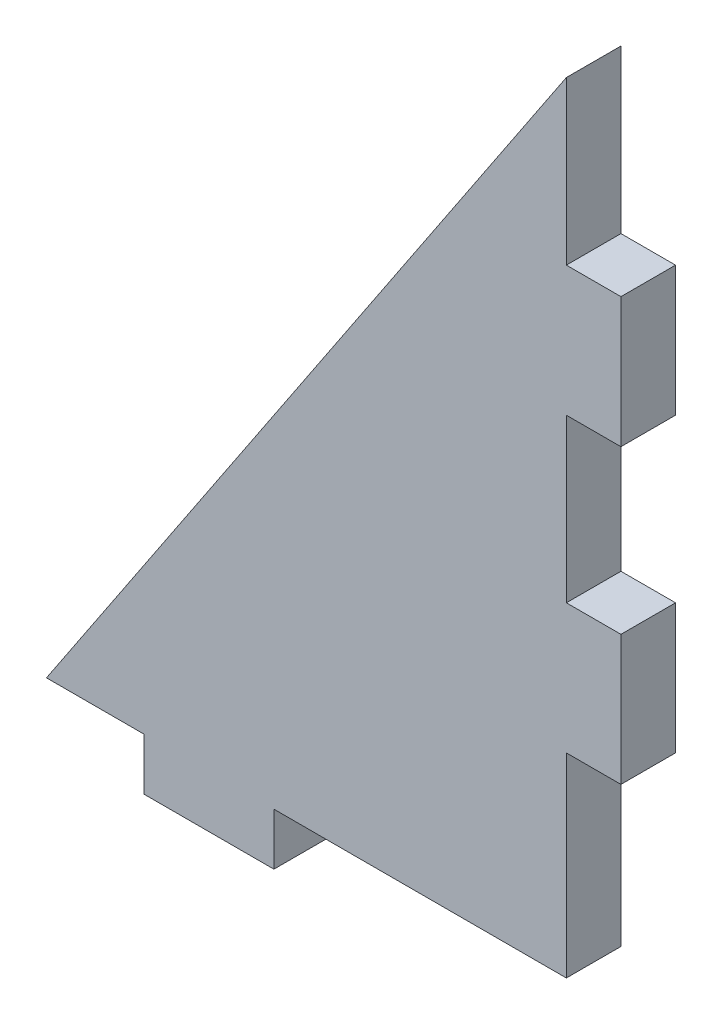
ISO-10303-21;
HEADER;
FILE_DESCRIPTION(('STEP AP214'),'2;1');
FILE_NAME('part.step','',(''),(''),'','','');
FILE_SCHEMA(('AUTOMOTIVE_DESIGN { 1 0 10303 214 1 1 1 1 }'));
ENDSEC;
DATA;
#1=APPLICATION_CONTEXT('core data for automotive mechanical design processes');
#2=APPLICATION_PROTOCOL_DEFINITION('international standard','automotive_design',2000,#1);
#3=PRODUCT_CONTEXT('',#1,'mechanical');
#4=PRODUCT('Part','Part','',(#3));
#5=PRODUCT_RELATED_PRODUCT_CATEGORY('part','',(#4));
#6=PRODUCT_DEFINITION_FORMATION('','',#4);
#7=PRODUCT_DEFINITION_CONTEXT('part definition',#1,'design');
#8=PRODUCT_DEFINITION('design','',#6,#7);
#9=PRODUCT_DEFINITION_SHAPE('','',#8);
#10=(LENGTH_UNIT() NAMED_UNIT(*) SI_UNIT(.MILLI.,.METRE.));
#11=(NAMED_UNIT(*) PLANE_ANGLE_UNIT() SI_UNIT($,.RADIAN.));
#12=(NAMED_UNIT(*) SI_UNIT($,.STERADIAN.) SOLID_ANGLE_UNIT());
#13=UNCERTAINTY_MEASURE_WITH_UNIT(LENGTH_MEASURE(1.E-05),#10,'distance_accuracy_value','');
#14=(GEOMETRIC_REPRESENTATION_CONTEXT(3) GLOBAL_UNCERTAINTY_ASSIGNED_CONTEXT((#13)) GLOBAL_UNIT_ASSIGNED_CONTEXT((#10,
#11,#12)) REPRESENTATION_CONTEXT('',''));
#15=CARTESIAN_POINT('',(0.,0.,0.));
#16=DIRECTION('',(0.,0.,1.));
#17=DIRECTION('',(1.,0.,0.));
#18=AXIS2_PLACEMENT_3D('',#15,#16,#17);
#19=CARTESIAN_POINT('',(-28.575,0.,5.334));
#20=DIRECTION('',(0.,1.,0.));
#21=DIRECTION('',(0.,0.,1.));
#22=AXIS2_PLACEMENT_3D('',#19,#20,#21);
#23=PLANE('',#22);
#24=DIRECTION('',(1.,0.,0.));
#25=VECTOR('',#24,1.);
#26=CARTESIAN_POINT('',(-28.575,0.,0.));
#27=LINE('',#26,#25);
#28=CARTESIAN_POINT('',(-28.575,0.,0.));
#29=VERTEX_POINT('',#28);
#30=CARTESIAN_POINT('',(0.,0.,0.));
#31=VERTEX_POINT('',#30);
#32=EDGE_CURVE('E174',#29,#31,#27,.T.);
#33=ORIENTED_EDGE('',*,*,#32,.T.);
#34=DIRECTION('',(0.,0.,-1.));
#35=VECTOR('',#34,1.);
#36=CARTESIAN_POINT('',(0.,0.,5.334));
#37=LINE('',#36,#35);
#38=CARTESIAN_POINT('',(0.,0.,5.334));
#39=VERTEX_POINT('',#38);
#40=EDGE_CURVE('E11',#39,#31,#37,.T.);
#41=ORIENTED_EDGE('',*,*,#40,.F.);
#42=DIRECTION('',(1.,0.,0.));
#43=VECTOR('',#42,1.);
#44=CARTESIAN_POINT('',(-28.575,0.,5.334));
#45=LINE('',#44,#43);
#46=CARTESIAN_POINT('',(-28.575,0.,5.334));
#47=VERTEX_POINT('',#46);
#48=EDGE_CURVE('E202',#47,#39,#45,.T.);
#49=ORIENTED_EDGE('',*,*,#48,.F.);
#50=DIRECTION('',(0.,0.,-1.));
#51=VECTOR('',#50,1.);
#52=CARTESIAN_POINT('',(-28.575,0.,5.334));
#53=LINE('',#52,#51);
#54=EDGE_CURVE('E170',#47,#29,#53,.T.);
#55=ORIENTED_EDGE('',*,*,#54,.T.);
#56=EDGE_LOOP('',(#33,#41,#49,#55));
#57=FACE_BOUND('',#56,.T.);
#58=ADVANCED_FACE('F36',(#57),#23,.F.);
#59=CARTESIAN_POINT('',(0.,0.,5.334));
#60=DIRECTION('',(-1.,0.,0.));
#61=DIRECTION('',(0.,0.,1.));
#62=AXIS2_PLACEMENT_3D('',#59,#60,#61);
#63=PLANE('',#62);
#64=DIRECTION('',(0.,1.,0.));
#65=VECTOR('',#64,1.);
#66=CARTESIAN_POINT('',(0.,0.,0.));
#67=LINE('',#66,#65);
#68=CARTESIAN_POINT('',(0.,19.05,0.));
#69=VERTEX_POINT('',#68);
#70=EDGE_CURVE('E177',#31,#69,#67,.T.);
#71=ORIENTED_EDGE('',*,*,#70,.T.);
#72=DIRECTION('',(0.,0.,-1.));
#73=VECTOR('',#72,1.);
#74=CARTESIAN_POINT('',(0.,19.05,5.334));
#75=LINE('',#74,#73);
#76=CARTESIAN_POINT('',(0.,19.05,5.334));
#77=VERTEX_POINT('',#76);
#78=EDGE_CURVE('E44',#77,#69,#75,.T.);
#79=ORIENTED_EDGE('',*,*,#78,.F.);
#80=DIRECTION('',(0.,1.,0.));
#81=VECTOR('',#80,1.);
#82=CARTESIAN_POINT('',(0.,0.,5.334));
#83=LINE('',#82,#81);
#84=EDGE_CURVE('E116',#39,#77,#83,.T.);
#85=ORIENTED_EDGE('',*,*,#84,.F.);
#86=ORIENTED_EDGE('',*,*,#40,.T.);
#87=EDGE_LOOP('',(#71,#79,#85,#86));
#88=FACE_BOUND('',#87,.T.);
#89=ADVANCED_FACE('F295',(#88),#63,.F.);
#90=CARTESIAN_POINT('',(0.,19.05,5.334));
#91=DIRECTION('',(0.,1.,0.));
#92=DIRECTION('',(0.,0.,1.));
#93=AXIS2_PLACEMENT_3D('',#90,#91,#92);
#94=PLANE('',#93);
#95=DIRECTION('',(1.,0.,0.));
#96=VECTOR('',#95,1.);
#97=CARTESIAN_POINT('',(0.,19.05,0.));
#98=LINE('',#97,#96);
#99=CARTESIAN_POINT('',(5.33399999999995,19.05,0.));
#100=VERTEX_POINT('',#99);
#101=EDGE_CURVE('E179',#69,#100,#98,.T.);
#102=ORIENTED_EDGE('',*,*,#101,.T.);
#103=DIRECTION('',(0.,0.,-1.));
#104=VECTOR('',#103,1.);
#105=CARTESIAN_POINT('',(5.33399999999995,19.05,5.334));
#106=LINE('',#105,#104);
#107=CARTESIAN_POINT('',(5.33399999999995,19.05,5.334));
#108=VERTEX_POINT('',#107);
#109=EDGE_CURVE('E230',#108,#100,#106,.T.);
#110=ORIENTED_EDGE('',*,*,#109,.F.);
#111=DIRECTION('',(1.,0.,0.));
#112=VECTOR('',#111,1.);
#113=CARTESIAN_POINT('',(0.,19.05,5.334));
#114=LINE('',#113,#112);
#115=EDGE_CURVE('E238',#77,#108,#114,.T.);
#116=ORIENTED_EDGE('',*,*,#115,.F.);
#117=ORIENTED_EDGE('',*,*,#78,.T.);
#118=EDGE_LOOP('',(#102,#110,#116,#117));
#119=FACE_BOUND('',#118,.T.);
#120=ADVANCED_FACE('F236',(#119),#94,.F.);
#121=CARTESIAN_POINT('',(5.33399999999995,19.05,5.334));
#122=DIRECTION('',(-1.,0.,0.));
#123=DIRECTION('',(0.,-1.,0.));
#124=AXIS2_PLACEMENT_3D('',#121,#122,#123);
#125=PLANE('',#124);
#126=DIRECTION('',(0.,1.,0.));
#127=VECTOR('',#126,1.);
#128=CARTESIAN_POINT('',(5.33399999999995,19.05,0.));
#129=LINE('',#128,#127);
#130=CARTESIAN_POINT('',(5.33399999999995,31.75,0.));
#131=VERTEX_POINT('',#130);
#132=EDGE_CURVE('E181',#100,#131,#129,.T.);
#133=ORIENTED_EDGE('',*,*,#132,.T.);
#134=DIRECTION('',(0.,0.,-1.));
#135=VECTOR('',#134,1.);
#136=CARTESIAN_POINT('',(5.33399999999995,31.75,5.334));
#137=LINE('',#136,#135);
#138=CARTESIAN_POINT('',(5.33399999999995,31.75,5.334));
#139=VERTEX_POINT('',#138);
#140=EDGE_CURVE('E227',#139,#131,#137,.T.);
#141=ORIENTED_EDGE('',*,*,#140,.F.);
#142=DIRECTION('',(0.,1.,0.));
#143=VECTOR('',#142,1.);
#144=CARTESIAN_POINT('',(5.33399999999995,19.05,5.334));
#145=LINE('',#144,#143);
#146=EDGE_CURVE('E256',#108,#139,#145,.T.);
#147=ORIENTED_EDGE('',*,*,#146,.F.);
#148=ORIENTED_EDGE('',*,*,#109,.T.);
#149=EDGE_LOOP('',(#133,#141,#147,#148));
#150=FACE_BOUND('',#149,.T.);
#151=ADVANCED_FACE('F247',(#150),#125,.F.);
#152=CARTESIAN_POINT('',(5.33399999999995,31.75,5.334));
#153=DIRECTION('',(0.,-1.,0.));
#154=DIRECTION('',(1.,0.,0.));
#155=AXIS2_PLACEMENT_3D('',#152,#153,#154);
#156=PLANE('',#155);
#157=DIRECTION('',(-1.,0.,0.));
#158=VECTOR('',#157,1.);
#159=CARTESIAN_POINT('',(5.33399999999995,31.75,0.));
#160=LINE('',#159,#158);
#161=CARTESIAN_POINT('',(0.,31.75,0.));
#162=VERTEX_POINT('',#161);
#163=EDGE_CURVE('E183',#131,#162,#160,.T.);
#164=ORIENTED_EDGE('',*,*,#163,.T.);
#165=DIRECTION('',(0.,0.,-1.));
#166=VECTOR('',#165,1.);
#167=CARTESIAN_POINT('',(0.,31.75,5.334));
#168=LINE('',#167,#166);
#169=CARTESIAN_POINT('',(0.,31.75,5.334));
#170=VERTEX_POINT('',#169);
#171=EDGE_CURVE('E224',#170,#162,#168,.T.);
#172=ORIENTED_EDGE('',*,*,#171,.F.);
#173=DIRECTION('',(-1.,0.,0.));
#174=VECTOR('',#173,1.);
#175=CARTESIAN_POINT('',(5.33399999999995,31.75,5.334));
#176=LINE('',#175,#174);
#177=EDGE_CURVE('E253',#139,#170,#176,.T.);
#178=ORIENTED_EDGE('',*,*,#177,.F.);
#179=ORIENTED_EDGE('',*,*,#140,.T.);
#180=EDGE_LOOP('',(#164,#172,#178,#179));
#181=FACE_BOUND('',#180,.T.);
#182=ADVANCED_FACE('F251',(#181),#156,.F.);
#183=CARTESIAN_POINT('',(0.,31.75,5.334));
#184=DIRECTION('',(-1.,0.,0.));
#185=DIRECTION('',(0.,-1.,0.));
#186=AXIS2_PLACEMENT_3D('',#183,#184,#185);
#187=PLANE('',#186);
#188=DIRECTION('',(0.,1.,0.));
#189=VECTOR('',#188,1.);
#190=CARTESIAN_POINT('',(0.,31.75,0.));
#191=LINE('',#190,#189);
#192=CARTESIAN_POINT('',(0.,47.625,0.));
#193=VERTEX_POINT('',#192);
#194=EDGE_CURVE('E185',#162,#193,#191,.T.);
#195=ORIENTED_EDGE('',*,*,#194,.T.);
#196=DIRECTION('',(0.,0.,-1.));
#197=VECTOR('',#196,1.);
#198=CARTESIAN_POINT('',(0.,47.625,5.334));
#199=LINE('',#198,#197);
#200=CARTESIAN_POINT('',(0.,47.625,5.334));
#201=VERTEX_POINT('',#200);
#202=EDGE_CURVE('E221',#201,#193,#199,.T.);
#203=ORIENTED_EDGE('',*,*,#202,.F.);
#204=DIRECTION('',(0.,1.,0.));
#205=VECTOR('',#204,1.);
#206=CARTESIAN_POINT('',(0.,31.75,5.334));
#207=LINE('',#206,#205);
#208=EDGE_CURVE('E255',#170,#201,#207,.T.);
#209=ORIENTED_EDGE('',*,*,#208,.F.);
#210=ORIENTED_EDGE('',*,*,#171,.T.);
#211=EDGE_LOOP('',(#195,#203,#209,#210));
#212=FACE_BOUND('',#211,.T.);
#213=ADVANCED_FACE('F308',(#212),#187,.F.);
#214=CARTESIAN_POINT('',(5.33399999999996,47.625,5.334));
#215=DIRECTION('',(0.,1.,0.));
#216=DIRECTION('',(0.,0.,1.));
#217=AXIS2_PLACEMENT_3D('',#214,#215,#216);
#218=PLANE('',#217);
#219=DIRECTION('',(1.,0.,0.));
#220=VECTOR('',#219,1.);
#221=CARTESIAN_POINT('',(5.33399999999996,47.625,0.));
#222=LINE('',#221,#220);
#223=CARTESIAN_POINT('',(5.33399999999996,47.625,0.));
#224=VERTEX_POINT('',#223);
#225=EDGE_CURVE('E187',#193,#224,#222,.T.);
#226=ORIENTED_EDGE('',*,*,#225,.T.);
#227=DIRECTION('',(0.,0.,-1.));
#228=VECTOR('',#227,1.);
#229=CARTESIAN_POINT('',(5.33399999999996,47.625,5.334));
#230=LINE('',#229,#228);
#231=CARTESIAN_POINT('',(5.33399999999996,47.625,5.334));
#232=VERTEX_POINT('',#231);
#233=EDGE_CURVE('E218',#232,#224,#230,.T.);
#234=ORIENTED_EDGE('',*,*,#233,.F.);
#235=DIRECTION('',(1.,0.,0.));
#236=VECTOR('',#235,1.);
#237=CARTESIAN_POINT('',(5.33399999999996,47.625,5.334));
#238=LINE('',#237,#236);
#239=EDGE_CURVE('E258',#201,#232,#238,.T.);
#240=ORIENTED_EDGE('',*,*,#239,.F.);
#241=ORIENTED_EDGE('',*,*,#202,.T.);
#242=EDGE_LOOP('',(#226,#234,#240,#241));
#243=FACE_BOUND('',#242,.T.);
#244=ADVANCED_FACE('F311',(#243),#218,.F.);
#245=CARTESIAN_POINT('',(5.33399999999995,60.325,5.334));
#246=DIRECTION('',(-1.,0.,0.));
#247=DIRECTION('',(0.,-1.,0.));
#248=AXIS2_PLACEMENT_3D('',#245,#246,#247);
#249=PLANE('',#248);
#250=DIRECTION('',(0.,1.,0.));
#251=VECTOR('',#250,1.);
#252=CARTESIAN_POINT('',(5.33399999999995,60.325,0.));
#253=LINE('',#252,#251);
#254=CARTESIAN_POINT('',(5.33399999999995,60.325,0.));
#255=VERTEX_POINT('',#254);
#256=EDGE_CURVE('E189',#224,#255,#253,.T.);
#257=ORIENTED_EDGE('',*,*,#256,.T.);
#258=DIRECTION('',(0.,0.,-1.));
#259=VECTOR('',#258,1.);
#260=CARTESIAN_POINT('',(5.33399999999995,60.325,5.334));
#261=LINE('',#260,#259);
#262=CARTESIAN_POINT('',(5.33399999999995,60.325,5.334));
#263=VERTEX_POINT('',#262);
#264=EDGE_CURVE('E215',#263,#255,#261,.T.);
#265=ORIENTED_EDGE('',*,*,#264,.F.);
#266=DIRECTION('',(0.,1.,0.));
#267=VECTOR('',#266,1.);
#268=CARTESIAN_POINT('',(5.33399999999995,60.325,5.334));
#269=LINE('',#268,#267);
#270=EDGE_CURVE('E264',#232,#263,#269,.T.);
#271=ORIENTED_EDGE('',*,*,#270,.F.);
#272=ORIENTED_EDGE('',*,*,#233,.T.);
#273=EDGE_LOOP('',(#257,#265,#271,#272));
#274=FACE_BOUND('',#273,.T.);
#275=ADVANCED_FACE('F315',(#274),#249,.F.);
#276=CARTESIAN_POINT('',(0.,60.325,5.334));
#277=DIRECTION('',(0.,-1.,0.));
#278=DIRECTION('',(1.,0.,0.));
#279=AXIS2_PLACEMENT_3D('',#276,#277,#278);
#280=PLANE('',#279);
#281=DIRECTION('',(-1.,0.,0.));
#282=VECTOR('',#281,1.);
#283=CARTESIAN_POINT('',(0.,60.325,0.));
#284=LINE('',#283,#282);
#285=CARTESIAN_POINT('',(0.,60.325,0.));
#286=VERTEX_POINT('',#285);
#287=EDGE_CURVE('E191',#255,#286,#284,.T.);
#288=ORIENTED_EDGE('',*,*,#287,.T.);
#289=DIRECTION('',(0.,0.,-1.));
#290=VECTOR('',#289,1.);
#291=CARTESIAN_POINT('',(0.,60.325,5.334));
#292=LINE('',#291,#290);
#293=CARTESIAN_POINT('',(0.,60.325,5.334));
#294=VERTEX_POINT('',#293);
#295=EDGE_CURVE('E212',#294,#286,#292,.T.);
#296=ORIENTED_EDGE('',*,*,#295,.F.);
#297=DIRECTION('',(-1.,0.,0.));
#298=VECTOR('',#297,1.);
#299=CARTESIAN_POINT('',(0.,60.325,5.334));
#300=LINE('',#299,#298);
#301=EDGE_CURVE('E266',#263,#294,#300,.T.);
#302=ORIENTED_EDGE('',*,*,#301,.F.);
#303=ORIENTED_EDGE('',*,*,#264,.T.);
#304=EDGE_LOOP('',(#288,#296,#302,#303));
#305=FACE_BOUND('',#304,.T.);
#306=ADVANCED_FACE('F319',(#305),#280,.F.);
#307=CARTESIAN_POINT('',(0.,76.2,5.334));
#308=DIRECTION('',(-1.,0.,0.));
#309=DIRECTION('',(0.,-1.,0.));
#310=AXIS2_PLACEMENT_3D('',#307,#308,#309);
#311=PLANE('',#310);
#312=DIRECTION('',(0.,1.,0.));
#313=VECTOR('',#312,1.);
#314=CARTESIAN_POINT('',(0.,76.2,0.));
#315=LINE('',#314,#313);
#316=CARTESIAN_POINT('',(0.,76.2,0.));
#317=VERTEX_POINT('',#316);
#318=EDGE_CURVE('E193',#286,#317,#315,.T.);
#319=ORIENTED_EDGE('',*,*,#318,.T.);
#320=DIRECTION('',(0.,0.,-1.));
#321=VECTOR('',#320,1.);
#322=CARTESIAN_POINT('',(0.,76.2,5.334));
#323=LINE('',#322,#321);
#324=CARTESIAN_POINT('',(0.,76.2,5.334));
#325=VERTEX_POINT('',#324);
#326=EDGE_CURVE('E209',#325,#317,#323,.T.);
#327=ORIENTED_EDGE('',*,*,#326,.F.);
#328=DIRECTION('',(0.,1.,0.));
#329=VECTOR('',#328,1.);
#330=CARTESIAN_POINT('',(0.,76.2,5.334));
#331=LINE('',#330,#329);
#332=EDGE_CURVE('E268',#294,#325,#331,.T.);
#333=ORIENTED_EDGE('',*,*,#332,.F.);
#334=ORIENTED_EDGE('',*,*,#295,.T.);
#335=EDGE_LOOP('',(#319,#327,#333,#334));
#336=FACE_BOUND('',#335,.T.);
#337=ADVANCED_FACE('F323',(#336),#311,.F.);
#338=CARTESIAN_POINT('',(0.,76.2,5.334));
#339=DIRECTION('',(0.832050294337844,-0.554700196225229,0.));
#340=DIRECTION('',(0.554700196225229,0.832050294337844,0.));
#341=AXIS2_PLACEMENT_3D('',#338,#339,#340);
#342=PLANE('',#341);
#343=DIRECTION('',(-0.554700196225229,-0.832050294337844,0.));
#344=VECTOR('',#343,1.);
#345=CARTESIAN_POINT('',(0.,76.2,0.));
#346=LINE('',#345,#344);
#347=CARTESIAN_POINT('',(-50.8,0.,0.));
#348=VERTEX_POINT('',#347);
#349=EDGE_CURVE('E195',#317,#348,#346,.T.);
#350=ORIENTED_EDGE('',*,*,#349,.T.);
#351=DIRECTION('',(0.,0.,-1.));
#352=VECTOR('',#351,1.);
#353=CARTESIAN_POINT('',(-50.8,0.,5.334));
#354=LINE('',#353,#352);
#355=CARTESIAN_POINT('',(-50.8,0.,5.334));
#356=VERTEX_POINT('',#355);
#357=EDGE_CURVE('E206',#356,#348,#354,.T.);
#358=ORIENTED_EDGE('',*,*,#357,.F.);
#359=DIRECTION('',(-0.554700196225229,-0.832050294337844,0.));
#360=VECTOR('',#359,1.);
#361=CARTESIAN_POINT('',(0.,76.2,5.334));
#362=LINE('',#361,#360);
#363=EDGE_CURVE('E270',#325,#356,#362,.T.);
#364=ORIENTED_EDGE('',*,*,#363,.F.);
#365=ORIENTED_EDGE('',*,*,#326,.T.);
#366=EDGE_LOOP('',(#350,#358,#364,#365));
#367=FACE_BOUND('',#366,.T.);
#368=ADVANCED_FACE('F276',(#367),#342,.F.);
#369=CARTESIAN_POINT('',(-50.8,0.,5.334));
#370=DIRECTION('',(0.,1.,0.));
#371=DIRECTION('',(0.,0.,1.));
#372=AXIS2_PLACEMENT_3D('',#369,#370,#371);
#373=PLANE('',#372);
#374=DIRECTION('',(1.,0.,0.));
#375=VECTOR('',#374,1.);
#376=CARTESIAN_POINT('',(-50.8,0.,0.));
#377=LINE('',#376,#375);
#378=CARTESIAN_POINT('',(-41.275,0.,0.));
#379=VERTEX_POINT('',#378);
#380=EDGE_CURVE('E197',#348,#379,#377,.T.);
#381=ORIENTED_EDGE('',*,*,#380,.T.);
#382=DIRECTION('',(0.,0.,-1.));
#383=VECTOR('',#382,1.);
#384=CARTESIAN_POINT('',(-41.275,0.,5.334));
#385=LINE('',#384,#383);
#386=CARTESIAN_POINT('',(-41.275,0.,5.334));
#387=VERTEX_POINT('',#386);
#388=EDGE_CURVE('E165',#387,#379,#385,.T.);
#389=ORIENTED_EDGE('',*,*,#388,.F.);
#390=DIRECTION('',(1.,0.,0.));
#391=VECTOR('',#390,1.);
#392=CARTESIAN_POINT('',(-50.8,0.,5.334));
#393=LINE('',#392,#391);
#394=EDGE_CURVE('E156',#356,#387,#393,.T.);
#395=ORIENTED_EDGE('',*,*,#394,.F.);
#396=ORIENTED_EDGE('',*,*,#357,.T.);
#397=EDGE_LOOP('',(#381,#389,#395,#396));
#398=FACE_BOUND('',#397,.T.);
#399=ADVANCED_FACE('F280',(#398),#373,.F.);
#400=CARTESIAN_POINT('',(-41.275,0.,5.334));
#401=DIRECTION('',(1.,0.,0.));
#402=DIRECTION('',(0.,0.,-1.));
#403=AXIS2_PLACEMENT_3D('',#400,#401,#402);
#404=PLANE('',#403);
#405=DIRECTION('',(0.,-1.,0.));
#406=VECTOR('',#405,1.);
#407=CARTESIAN_POINT('',(-41.275,0.,0.));
#408=LINE('',#407,#406);
#409=CARTESIAN_POINT('',(-41.275,-5.08,0.));
#410=VERTEX_POINT('',#409);
#411=EDGE_CURVE('E164',#379,#410,#408,.T.);
#412=ORIENTED_EDGE('',*,*,#411,.T.);
#413=DIRECTION('',(0.,0.,-1.));
#414=VECTOR('',#413,1.);
#415=CARTESIAN_POINT('',(-41.275,-5.08,5.334));
#416=LINE('',#415,#414);
#417=CARTESIAN_POINT('',(-41.275,-5.08,5.334));
#418=VERTEX_POINT('',#417);
#419=EDGE_CURVE('E161',#418,#410,#416,.T.);
#420=ORIENTED_EDGE('',*,*,#419,.F.);
#421=DIRECTION('',(0.,-1.,0.));
#422=VECTOR('',#421,1.);
#423=CARTESIAN_POINT('',(-41.275,0.,5.334));
#424=LINE('',#423,#422);
#425=EDGE_CURVE('E150',#387,#418,#424,.T.);
#426=ORIENTED_EDGE('',*,*,#425,.F.);
#427=ORIENTED_EDGE('',*,*,#388,.T.);
#428=EDGE_LOOP('',(#412,#420,#426,#427));
#429=FACE_BOUND('',#428,.T.);
#430=ADVANCED_FACE('F162',(#429),#404,.F.);
#431=CARTESIAN_POINT('',(-41.275,-5.08,5.334));
#432=DIRECTION('',(0.,1.,0.));
#433=DIRECTION('',(0.,0.,1.));
#434=AXIS2_PLACEMENT_3D('',#431,#432,#433);
#435=PLANE('',#434);
#436=DIRECTION('',(1.,0.,0.));
#437=VECTOR('',#436,1.);
#438=CARTESIAN_POINT('',(-41.275,-5.08,0.));
#439=LINE('',#438,#437);
#440=CARTESIAN_POINT('',(-28.575,-5.08,0.));
#441=VERTEX_POINT('',#440);
#442=EDGE_CURVE('E102',#410,#441,#439,.T.);
#443=ORIENTED_EDGE('',*,*,#442,.T.);
#444=DIRECTION('',(0.,0.,-1.));
#445=VECTOR('',#444,1.);
#446=CARTESIAN_POINT('',(-28.575,-5.08,5.334));
#447=LINE('',#446,#445);
#448=CARTESIAN_POINT('',(-28.575,-5.08,5.334));
#449=VERTEX_POINT('',#448);
#450=EDGE_CURVE('E166',#449,#441,#447,.T.);
#451=ORIENTED_EDGE('',*,*,#450,.F.);
#452=DIRECTION('',(1.,0.,0.));
#453=VECTOR('',#452,1.);
#454=CARTESIAN_POINT('',(-41.275,-5.08,5.334));
#455=LINE('',#454,#453);
#456=EDGE_CURVE('E154',#418,#449,#455,.T.);
#457=ORIENTED_EDGE('',*,*,#456,.F.);
#458=ORIENTED_EDGE('',*,*,#419,.T.);
#459=EDGE_LOOP('',(#443,#451,#457,#458));
#460=FACE_BOUND('',#459,.T.);
#461=ADVANCED_FACE('F168',(#460),#435,.F.);
#462=CARTESIAN_POINT('',(-28.575,-5.08,5.334));
#463=DIRECTION('',(-1.,0.,0.));
#464=DIRECTION('',(0.,-1.,0.));
#465=AXIS2_PLACEMENT_3D('',#462,#463,#464);
#466=PLANE('',#465);
#467=DIRECTION('',(0.,1.,0.));
#468=VECTOR('',#467,1.);
#469=CARTESIAN_POINT('',(-28.575,-5.08,0.));
#470=LINE('',#469,#468);
#471=EDGE_CURVE('E108',#441,#29,#470,.T.);
#472=ORIENTED_EDGE('',*,*,#471,.T.);
#473=ORIENTED_EDGE('',*,*,#54,.F.);
#474=DIRECTION('',(0.,1.,0.));
#475=VECTOR('',#474,1.);
#476=CARTESIAN_POINT('',(-28.575,-5.08,5.334));
#477=LINE('',#476,#475);
#478=EDGE_CURVE('E52',#449,#47,#477,.T.);
#479=ORIENTED_EDGE('',*,*,#478,.F.);
#480=ORIENTED_EDGE('',*,*,#450,.T.);
#481=EDGE_LOOP('',(#472,#473,#479,#480));
#482=FACE_BOUND('',#481,.T.);
#483=ADVANCED_FACE('F284',(#482),#466,.F.);
#484=CARTESIAN_POINT('',(0.,0.,5.334));
#485=DIRECTION('',(0.,0.,1.));
#486=DIRECTION('',(1.,0.,0.));
#487=AXIS2_PLACEMENT_3D('',#484,#485,#486);
#488=PLANE('',#487);
#489=ORIENTED_EDGE('',*,*,#48,.T.);
#490=ORIENTED_EDGE('',*,*,#84,.T.);
#491=ORIENTED_EDGE('',*,*,#115,.T.);
#492=ORIENTED_EDGE('',*,*,#146,.T.);
#493=ORIENTED_EDGE('',*,*,#177,.T.);
#494=ORIENTED_EDGE('',*,*,#208,.T.);
#495=ORIENTED_EDGE('',*,*,#239,.T.);
#496=ORIENTED_EDGE('',*,*,#270,.T.);
#497=ORIENTED_EDGE('',*,*,#301,.T.);
#498=ORIENTED_EDGE('',*,*,#332,.T.);
#499=ORIENTED_EDGE('',*,*,#363,.T.);
#500=ORIENTED_EDGE('',*,*,#394,.T.);
#501=ORIENTED_EDGE('',*,*,#425,.T.);
#502=ORIENTED_EDGE('',*,*,#456,.T.);
#503=ORIENTED_EDGE('',*,*,#478,.T.);
#504=EDGE_LOOP('',(#489,#490,#491,#492,#493,#494,#495,#496,#497,#498,#499,#500,#501,#502,#503));
#505=FACE_BOUND('',#504,.T.);
#506=ADVANCED_FACE('F152',(#505),#488,.T.);
#507=CARTESIAN_POINT('',(0.,0.,0.));
#508=DIRECTION('',(0.,0.,1.));
#509=DIRECTION('',(1.,0.,0.));
#510=AXIS2_PLACEMENT_3D('',#507,#508,#509);
#511=PLANE('',#510);
#512=ORIENTED_EDGE('',*,*,#32,.F.);
#513=ORIENTED_EDGE('',*,*,#471,.F.);
#514=ORIENTED_EDGE('',*,*,#442,.F.);
#515=ORIENTED_EDGE('',*,*,#411,.F.);
#516=ORIENTED_EDGE('',*,*,#380,.F.);
#517=ORIENTED_EDGE('',*,*,#349,.F.);
#518=ORIENTED_EDGE('',*,*,#318,.F.);
#519=ORIENTED_EDGE('',*,*,#287,.F.);
#520=ORIENTED_EDGE('',*,*,#256,.F.);
#521=ORIENTED_EDGE('',*,*,#225,.F.);
#522=ORIENTED_EDGE('',*,*,#194,.F.);
#523=ORIENTED_EDGE('',*,*,#163,.F.);
#524=ORIENTED_EDGE('',*,*,#132,.F.);
#525=ORIENTED_EDGE('',*,*,#101,.F.);
#526=ORIENTED_EDGE('',*,*,#70,.F.);
#527=EDGE_LOOP('',(#512,#513,#514,#515,#516,#517,#518,#519,#520,#521,#522,#523,#524,#525,#526));
#528=FACE_BOUND('',#527,.T.);
#529=ADVANCED_FACE('F242',(#528),#511,.F.);
#530=CLOSED_SHELL('',(#58,#89,#120,#151,#182,#213,#244,#275,#306,#337,#368,#399,#430,#461,#483,
#506,#529));
#531=MANIFOLD_SOLID_BREP('B2',#530);
#532=ADVANCED_BREP_SHAPE_REPRESENTATION('',(#18,#531),#14);
#533=SHAPE_DEFINITION_REPRESENTATION(#9,#532);
ENDSEC;
END-ISO-10303-21;
